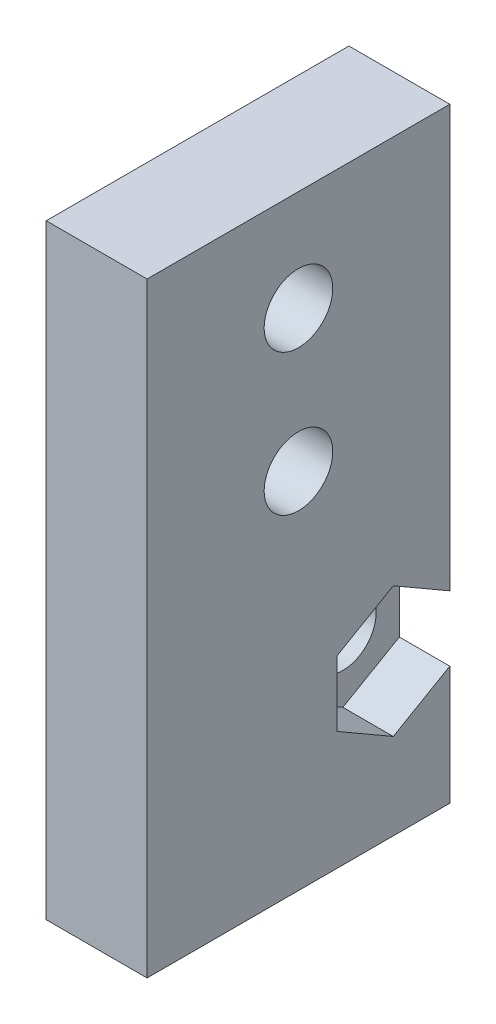
ISO-10303-21;
HEADER;
FILE_DESCRIPTION(('STEP AP214'),'2;1');
FILE_NAME('part.step','',(''),(''),'','','');
FILE_SCHEMA(('AUTOMOTIVE_DESIGN { 1 0 10303 214 1 1 1 1 }'));
ENDSEC;
DATA;
#1=APPLICATION_CONTEXT('core data for automotive mechanical design processes');
#2=APPLICATION_PROTOCOL_DEFINITION('international standard','automotive_design',2000,#1);
#3=PRODUCT_CONTEXT('',#1,'mechanical');
#4=PRODUCT('Part','Part','',(#3));
#5=PRODUCT_RELATED_PRODUCT_CATEGORY('part','',(#4));
#6=PRODUCT_DEFINITION_FORMATION('','',#4);
#7=PRODUCT_DEFINITION_CONTEXT('part definition',#1,'design');
#8=PRODUCT_DEFINITION('design','',#6,#7);
#9=PRODUCT_DEFINITION_SHAPE('','',#8);
#10=(LENGTH_UNIT() NAMED_UNIT(*) SI_UNIT(.MILLI.,.METRE.));
#11=(NAMED_UNIT(*) PLANE_ANGLE_UNIT() SI_UNIT($,.RADIAN.));
#12=(NAMED_UNIT(*) SI_UNIT($,.STERADIAN.) SOLID_ANGLE_UNIT());
#13=UNCERTAINTY_MEASURE_WITH_UNIT(LENGTH_MEASURE(1.E-05),#10,'distance_accuracy_value','');
#14=(GEOMETRIC_REPRESENTATION_CONTEXT(3) GLOBAL_UNCERTAINTY_ASSIGNED_CONTEXT((#13)) GLOBAL_UNIT_ASSIGNED_CONTEXT((#10,
#11,#12)) REPRESENTATION_CONTEXT('',''));
#15=CARTESIAN_POINT('',(0.,0.,0.));
#16=DIRECTION('',(0.,0.,1.));
#17=DIRECTION('',(1.,0.,0.));
#18=AXIS2_PLACEMENT_3D('',#15,#16,#17);
#19=CARTESIAN_POINT('',(2.5,0.,0.));
#20=DIRECTION('',(1.,0.,0.));
#21=DIRECTION('',(0.,0.,1.));
#22=AXIS2_PLACEMENT_3D('',#19,#20,#21);
#23=PLANE('',#22);
#24=CARTESIAN_POINT('',(2.5,18.,7.5));
#25=DIRECTION('',(-1.,0.,0.));
#26=DIRECTION('',(0.,0.,1.));
#27=AXIS2_PLACEMENT_3D('',#24,#25,#26);
#28=CIRCLE('',#27,1.7);
#29=CARTESIAN_POINT('',(2.5,18.,9.2));
#30=VERTEX_POINT('',#29);
#31=EDGE_CURVE('E217',#30,#30,#28,.T.);
#32=ORIENTED_EDGE('',*,*,#31,.T.);
#33=EDGE_LOOP('',(#32));
#34=FACE_BOUND('',#33,.T.);
#35=CARTESIAN_POINT('',(2.5,25.,7.5));
#36=DIRECTION('',(-1.,0.,0.));
#37=DIRECTION('',(0.,0.,1.));
#38=AXIS2_PLACEMENT_3D('',#35,#36,#37);
#39=CIRCLE('',#38,1.7);
#40=CARTESIAN_POINT('',(2.5,25.,9.2));
#41=VERTEX_POINT('',#40);
#42=EDGE_CURVE('E233',#41,#41,#39,.T.);
#43=ORIENTED_EDGE('',*,*,#42,.T.);
#44=EDGE_LOOP('',(#43));
#45=FACE_BOUND('',#44,.T.);
#46=DIRECTION('',(0.,0.5,0.866025403784438));
#47=VECTOR('',#46,1.);
#48=CARTESIAN_POINT('',(2.5,4.26683849253807,2.8));
#49=LINE('',#48,#47);
#50=CARTESIAN_POINT('',(2.5,4.26683849253807,2.8));
#51=VERTEX_POINT('',#50);
#52=CARTESIAN_POINT('',(2.5,5.88341924626903,5.60000000000002));
#53=VERTEX_POINT('',#52);
#54=EDGE_CURVE('E176',#51,#53,#49,.T.);
#55=ORIENTED_EDGE('',*,*,#54,.T.);
#56=DIRECTION('',(0.,1.,0.));
#57=VECTOR('',#56,1.);
#58=CARTESIAN_POINT('',(2.5,5.88341924626903,5.60000000000002));
#59=LINE('',#58,#57);
#60=CARTESIAN_POINT('',(2.5,9.11658075373097,5.60000000000002));
#61=VERTEX_POINT('',#60);
#62=EDGE_CURVE('E180',#53,#61,#59,.T.);
#63=ORIENTED_EDGE('',*,*,#62,.T.);
#64=DIRECTION('',(0.,0.5,-0.866025403784439));
#65=VECTOR('',#64,1.);
#66=CARTESIAN_POINT('',(2.5,9.11658075373097,5.60000000000002));
#67=LINE('',#66,#65);
#68=CARTESIAN_POINT('',(2.5,10.7331615074619,2.8));
#69=VERTEX_POINT('',#68);
#70=EDGE_CURVE('E183',#61,#69,#67,.T.);
#71=ORIENTED_EDGE('',*,*,#70,.T.);
#72=DIRECTION('',(0.,-0.5,-0.866025403784439));
#73=VECTOR('',#72,1.);
#74=CARTESIAN_POINT('',(2.5,10.7331615074619,2.8));
#75=LINE('',#74,#73);
#76=CARTESIAN_POINT('',(2.5,9.11658075373096,0.));
#77=VERTEX_POINT('',#76);
#78=EDGE_CURVE('E186',#69,#77,#75,.T.);
#79=ORIENTED_EDGE('',*,*,#78,.T.);
#80=DIRECTION('',(0.,1.,0.));
#81=VECTOR('',#80,1.);
#82=CARTESIAN_POINT('',(2.5,0.,0.));
#83=LINE('',#82,#81);
#84=CARTESIAN_POINT('',(2.5,30.,0.));
#85=VERTEX_POINT('',#84);
#86=EDGE_CURVE('E223',#77,#85,#83,.T.);
#87=ORIENTED_EDGE('',*,*,#86,.T.);
#88=DIRECTION('',(0.,0.,1.));
#89=VECTOR('',#88,1.);
#90=CARTESIAN_POINT('',(2.5,30.,0.));
#91=LINE('',#90,#89);
#92=CARTESIAN_POINT('',(2.5,30.,15.));
#93=VERTEX_POINT('',#92);
#94=EDGE_CURVE('E220',#85,#93,#91,.T.);
#95=ORIENTED_EDGE('',*,*,#94,.T.);
#96=DIRECTION('',(0.,1.,0.));
#97=VECTOR('',#96,1.);
#98=CARTESIAN_POINT('',(2.5,0.,15.));
#99=LINE('',#98,#97);
#100=CARTESIAN_POINT('',(2.5,0.,15.));
#101=VERTEX_POINT('',#100);
#102=EDGE_CURVE('E230',#101,#93,#99,.T.);
#103=ORIENTED_EDGE('',*,*,#102,.F.);
#104=DIRECTION('',(0.,0.,1.));
#105=VECTOR('',#104,1.);
#106=CARTESIAN_POINT('',(2.5,0.,0.));
#107=LINE('',#106,#105);
#108=CARTESIAN_POINT('',(2.5,0.,0.));
#109=VERTEX_POINT('',#108);
#110=EDGE_CURVE('E227',#109,#101,#107,.T.);
#111=ORIENTED_EDGE('',*,*,#110,.F.);
#112=CARTESIAN_POINT('',(2.5,5.88341924626903,0.));
#113=VERTEX_POINT('',#112);
#114=EDGE_CURVE('E224',#109,#113,#83,.T.);
#115=ORIENTED_EDGE('',*,*,#114,.T.);
#116=DIRECTION('',(0.,-0.5,0.866025403784438));
#117=VECTOR('',#116,1.);
#118=CARTESIAN_POINT('',(2.5,5.88341924626903,0.));
#119=LINE('',#118,#117);
#120=EDGE_CURVE('E173',#113,#51,#119,.T.);
#121=ORIENTED_EDGE('',*,*,#120,.T.);
#122=EDGE_LOOP('',(#55,#63,#71,#79,#87,#95,#103,#111,#115,#121));
#123=FACE_BOUND('',#122,.T.);
#124=ADVANCED_FACE('F37',(#34,#45,#123),#23,.T.);
#125=CARTESIAN_POINT('',(2.5,0.,0.));
#126=DIRECTION('',(0.,0.,-1.));
#127=DIRECTION('',(1.,0.,0.));
#128=AXIS2_PLACEMENT_3D('',#125,#126,#127);
#129=PLANE('',#128);
#130=DIRECTION('',(-1.,0.,0.));
#131=VECTOR('',#130,1.);
#132=CARTESIAN_POINT('',(2.5,30.,0.));
#133=LINE('',#132,#131);
#134=CARTESIAN_POINT('',(-2.5,30.,0.));
#135=VERTEX_POINT('',#134);
#136=EDGE_CURVE('E11',#85,#135,#133,.T.);
#137=ORIENTED_EDGE('',*,*,#136,.F.);
#138=ORIENTED_EDGE('',*,*,#86,.F.);
#139=DIRECTION('',(-1.,0.,0.));
#140=VECTOR('',#139,1.);
#141=CARTESIAN_POINT('',(2.5,9.11658075373096,0.));
#142=LINE('',#141,#140);
#143=CARTESIAN_POINT('',(0.,9.11658075373098,0.));
#144=VERTEX_POINT('',#143);
#145=EDGE_CURVE('E60',#77,#144,#142,.T.);
#146=ORIENTED_EDGE('',*,*,#145,.T.);
#147=DIRECTION('',(0.,1.,0.));
#148=VECTOR('',#147,1.);
#149=CARTESIAN_POINT('',(0.,0.,0.));
#150=LINE('',#149,#148);
#151=CARTESIAN_POINT('',(0.,5.88341924626903,0.));
#152=VERTEX_POINT('',#151);
#153=EDGE_CURVE('E152',#152,#144,#150,.T.);
#154=ORIENTED_EDGE('',*,*,#153,.F.);
#155=DIRECTION('',(-1.,0.,0.));
#156=VECTOR('',#155,1.);
#157=CARTESIAN_POINT('',(2.5,5.88341924626903,0.));
#158=LINE('',#157,#156);
#159=EDGE_CURVE('E214',#113,#152,#158,.T.);
#160=ORIENTED_EDGE('',*,*,#159,.F.);
#161=ORIENTED_EDGE('',*,*,#114,.F.);
#162=DIRECTION('',(-1.,0.,0.));
#163=VECTOR('',#162,1.);
#164=CARTESIAN_POINT('',(2.5,0.,0.));
#165=LINE('',#164,#163);
#166=CARTESIAN_POINT('',(-2.5,0.,0.));
#167=VERTEX_POINT('',#166);
#168=EDGE_CURVE('E45',#109,#167,#165,.T.);
#169=ORIENTED_EDGE('',*,*,#168,.T.);
#170=DIRECTION('',(0.,1.,0.));
#171=VECTOR('',#170,1.);
#172=CARTESIAN_POINT('',(-2.5,0.,0.));
#173=LINE('',#172,#171);
#174=CARTESIAN_POINT('',(-2.5,5.15852610520638,0.));
#175=VERTEX_POINT('',#174);
#176=EDGE_CURVE('E158',#167,#175,#173,.T.);
#177=ORIENTED_EDGE('',*,*,#176,.T.);
#178=DIRECTION('',(1.,0.,0.));
#179=VECTOR('',#178,1.);
#180=CARTESIAN_POINT('',(-3.5,5.15852610520638,0.));
#181=LINE('',#180,#179);
#182=CARTESIAN_POINT('',(-3.5,5.15852610520638,0.));
#183=VERTEX_POINT('',#182);
#184=EDGE_CURVE('E132',#183,#175,#181,.T.);
#185=ORIENTED_EDGE('',*,*,#184,.F.);
#186=DIRECTION('',(0.,1.,0.));
#187=VECTOR('',#186,1.);
#188=CARTESIAN_POINT('',(-3.5,0.,0.));
#189=LINE('',#188,#187);
#190=CARTESIAN_POINT('',(-3.5,9.84147389479362,0.));
#191=VERTEX_POINT('',#190);
#192=EDGE_CURVE('E130',#183,#191,#189,.T.);
#193=ORIENTED_EDGE('',*,*,#192,.T.);
#194=DIRECTION('',(1.,0.,0.));
#195=VECTOR('',#194,1.);
#196=CARTESIAN_POINT('',(-3.5,9.84147389479362,0.));
#197=LINE('',#196,#195);
#198=CARTESIAN_POINT('',(-2.5,9.84147389479362,0.));
#199=VERTEX_POINT('',#198);
#200=EDGE_CURVE('E135',#191,#199,#197,.T.);
#201=ORIENTED_EDGE('',*,*,#200,.T.);
#202=EDGE_CURVE('E156',#199,#135,#173,.T.);
#203=ORIENTED_EDGE('',*,*,#202,.T.);
#204=EDGE_LOOP('',(#137,#138,#146,#154,#160,#161,#169,#177,#185,#193,#201,#203));
#205=FACE_BOUND('',#204,.T.);
#206=ADVANCED_FACE('F141',(#205),#129,.T.);
#207=CARTESIAN_POINT('',(2.5,30.,0.));
#208=DIRECTION('',(0.,1.,0.));
#209=DIRECTION('',(0.,0.,-1.));
#210=AXIS2_PLACEMENT_3D('',#207,#208,#209);
#211=PLANE('',#210);
#212=DIRECTION('',(-1.,0.,0.));
#213=VECTOR('',#212,1.);
#214=CARTESIAN_POINT('',(2.5,30.,15.));
#215=LINE('',#214,#213);
#216=CARTESIAN_POINT('',(-2.5,30.,15.));
#217=VERTEX_POINT('',#216);
#218=EDGE_CURVE('E236',#93,#217,#215,.T.);
#219=ORIENTED_EDGE('',*,*,#218,.F.);
#220=ORIENTED_EDGE('',*,*,#94,.F.);
#221=ORIENTED_EDGE('',*,*,#136,.T.);
#222=DIRECTION('',(0.,0.,1.));
#223=VECTOR('',#222,1.);
#224=CARTESIAN_POINT('',(-2.5,30.,0.));
#225=LINE('',#224,#223);
#226=EDGE_CURVE('E153',#135,#217,#225,.T.);
#227=ORIENTED_EDGE('',*,*,#226,.T.);
#228=EDGE_LOOP('',(#219,#220,#221,#227));
#229=FACE_BOUND('',#228,.T.);
#230=ADVANCED_FACE('F39',(#229),#211,.T.);
#231=CARTESIAN_POINT('',(2.5,0.,0.));
#232=DIRECTION('',(0.,1.,0.));
#233=DIRECTION('',(0.,0.,-1.));
#234=AXIS2_PLACEMENT_3D('',#231,#232,#233);
#235=PLANE('',#234);
#236=ORIENTED_EDGE('',*,*,#168,.F.);
#237=ORIENTED_EDGE('',*,*,#110,.T.);
#238=DIRECTION('',(-1.,0.,0.));
#239=VECTOR('',#238,1.);
#240=CARTESIAN_POINT('',(2.5,0.,15.));
#241=LINE('',#240,#239);
#242=CARTESIAN_POINT('',(-2.5,0.,15.));
#243=VERTEX_POINT('',#242);
#244=EDGE_CURVE('E239',#101,#243,#241,.T.);
#245=ORIENTED_EDGE('',*,*,#244,.T.);
#246=DIRECTION('',(0.,0.,1.));
#247=VECTOR('',#246,1.);
#248=CARTESIAN_POINT('',(-2.5,0.,0.));
#249=LINE('',#248,#247);
#250=EDGE_CURVE('E160',#167,#243,#249,.T.);
#251=ORIENTED_EDGE('',*,*,#250,.F.);
#252=EDGE_LOOP('',(#236,#237,#245,#251));
#253=FACE_BOUND('',#252,.T.);
#254=ADVANCED_FACE('F246',(#253),#235,.F.);
#255=CARTESIAN_POINT('',(2.5,25.,7.5));
#256=DIRECTION('',(-1.,0.,0.));
#257=DIRECTION('',(0.,0.,-1.));
#258=AXIS2_PLACEMENT_3D('',#255,#256,#257);
#259=CYLINDRICAL_SURFACE('',#258,1.7);
#260=ORIENTED_EDGE('',*,*,#42,.F.);
#261=EDGE_LOOP('',(#260));
#262=FACE_BOUND('',#261,.T.);
#263=CARTESIAN_POINT('',(-2.5,25.,7.5));
#264=DIRECTION('',(-1.,0.,0.));
#265=DIRECTION('',(0.,0.,1.));
#266=AXIS2_PLACEMENT_3D('',#263,#264,#265);
#267=CIRCLE('',#266,1.7);
#268=CARTESIAN_POINT('',(-2.5,25.,9.2));
#269=VERTEX_POINT('',#268);
#270=EDGE_CURVE('E165',#269,#269,#267,.T.);
#271=ORIENTED_EDGE('',*,*,#270,.T.);
#272=EDGE_LOOP('',(#271));
#273=FACE_BOUND('',#272,.T.);
#274=ADVANCED_FACE('F267',(#262,#273),#259,.F.);
#275=CARTESIAN_POINT('',(2.5,0.,15.));
#276=DIRECTION('',(0.,0.,-1.));
#277=DIRECTION('',(1.,0.,0.));
#278=AXIS2_PLACEMENT_3D('',#275,#276,#277);
#279=PLANE('',#278);
#280=ORIENTED_EDGE('',*,*,#244,.F.);
#281=ORIENTED_EDGE('',*,*,#102,.T.);
#282=ORIENTED_EDGE('',*,*,#218,.T.);
#283=DIRECTION('',(0.,1.,0.));
#284=VECTOR('',#283,1.);
#285=CARTESIAN_POINT('',(-2.5,0.,15.));
#286=LINE('',#285,#284);
#287=EDGE_CURVE('E163',#243,#217,#286,.T.);
#288=ORIENTED_EDGE('',*,*,#287,.F.);
#289=EDGE_LOOP('',(#280,#281,#282,#288));
#290=FACE_BOUND('',#289,.T.);
#291=ADVANCED_FACE('F264',(#290),#279,.F.);
#292=CARTESIAN_POINT('',(2.5,18.,7.5));
#293=DIRECTION('',(-1.,0.,0.));
#294=DIRECTION('',(0.,0.,-1.));
#295=AXIS2_PLACEMENT_3D('',#292,#293,#294);
#296=CYLINDRICAL_SURFACE('',#295,1.7);
#297=ORIENTED_EDGE('',*,*,#31,.F.);
#298=EDGE_LOOP('',(#297));
#299=FACE_BOUND('',#298,.T.);
#300=CARTESIAN_POINT('',(-2.5,18.,7.5));
#301=DIRECTION('',(-1.,0.,0.));
#302=DIRECTION('',(0.,0.,1.));
#303=AXIS2_PLACEMENT_3D('',#300,#301,#302);
#304=CIRCLE('',#303,1.7);
#305=CARTESIAN_POINT('',(-2.5,18.,9.2));
#306=VERTEX_POINT('',#305);
#307=EDGE_CURVE('E139',#306,#306,#304,.T.);
#308=ORIENTED_EDGE('',*,*,#307,.T.);
#309=EDGE_LOOP('',(#308));
#310=FACE_BOUND('',#309,.T.);
#311=ADVANCED_FACE('F266',(#299,#310),#296,.F.);
#312=CARTESIAN_POINT('',(2.5,5.88341924626903,0.));
#313=DIRECTION('',(0.,0.866025403784438,0.5));
#314=DIRECTION('',(0.,0.5,-0.866025403784439));
#315=AXIS2_PLACEMENT_3D('',#312,#313,#314);
#316=PLANE('',#315);
#317=DIRECTION('',(0.,-0.5,0.866025403784438));
#318=VECTOR('',#317,1.);
#319=CARTESIAN_POINT('',(0.,5.88341924626903,0.));
#320=LINE('',#319,#318);
#321=CARTESIAN_POINT('',(0.,4.26683849253807,2.8));
#322=VERTEX_POINT('',#321);
#323=EDGE_CURVE('E168',#152,#322,#320,.T.);
#324=ORIENTED_EDGE('',*,*,#323,.T.);
#325=DIRECTION('',(-1.,0.,0.));
#326=VECTOR('',#325,1.);
#327=CARTESIAN_POINT('',(2.5,4.26683849253807,2.8));
#328=LINE('',#327,#326);
#329=EDGE_CURVE('E211',#51,#322,#328,.T.);
#330=ORIENTED_EDGE('',*,*,#329,.F.);
#331=ORIENTED_EDGE('',*,*,#120,.F.);
#332=ORIENTED_EDGE('',*,*,#159,.T.);
#333=EDGE_LOOP('',(#324,#330,#331,#332));
#334=FACE_BOUND('',#333,.T.);
#335=ADVANCED_FACE('F261',(#334),#316,.T.);
#336=CARTESIAN_POINT('',(2.5,4.26683849253807,2.8));
#337=DIRECTION('',(0.,0.866025403784438,-0.5));
#338=DIRECTION('',(0.,-0.5,-0.866025403784439));
#339=AXIS2_PLACEMENT_3D('',#336,#337,#338);
#340=PLANE('',#339);
#341=DIRECTION('',(0.,0.5,0.866025403784438));
#342=VECTOR('',#341,1.);
#343=CARTESIAN_POINT('',(0.,4.26683849253807,2.8));
#344=LINE('',#343,#342);
#345=CARTESIAN_POINT('',(0.,5.88341924626903,5.60000000000002));
#346=VERTEX_POINT('',#345);
#347=EDGE_CURVE('E191',#322,#346,#344,.T.);
#348=ORIENTED_EDGE('',*,*,#347,.T.);
#349=DIRECTION('',(-1.,0.,0.));
#350=VECTOR('',#349,1.);
#351=CARTESIAN_POINT('',(2.5,5.88341924626903,5.60000000000002));
#352=LINE('',#351,#350);
#353=EDGE_CURVE('E208',#53,#346,#352,.T.);
#354=ORIENTED_EDGE('',*,*,#353,.F.);
#355=ORIENTED_EDGE('',*,*,#54,.F.);
#356=ORIENTED_EDGE('',*,*,#329,.T.);
#357=EDGE_LOOP('',(#348,#354,#355,#356));
#358=FACE_BOUND('',#357,.T.);
#359=ADVANCED_FACE('F288',(#358),#340,.T.);
#360=CARTESIAN_POINT('',(2.5,5.88341924626903,5.60000000000002));
#361=DIRECTION('',(0.,0.,-1.));
#362=DIRECTION('',(1.,0.,0.));
#363=AXIS2_PLACEMENT_3D('',#360,#361,#362);
#364=PLANE('',#363);
#365=DIRECTION('',(0.,1.,0.));
#366=VECTOR('',#365,1.);
#367=CARTESIAN_POINT('',(0.,5.88341924626903,5.60000000000002));
#368=LINE('',#367,#366);
#369=CARTESIAN_POINT('',(0.,9.11658075373097,5.60000000000002));
#370=VERTEX_POINT('',#369);
#371=EDGE_CURVE('E194',#346,#370,#368,.T.);
#372=ORIENTED_EDGE('',*,*,#371,.T.);
#373=DIRECTION('',(-1.,0.,0.));
#374=VECTOR('',#373,1.);
#375=CARTESIAN_POINT('',(2.5,9.11658075373097,5.60000000000002));
#376=LINE('',#375,#374);
#377=EDGE_CURVE('E205',#61,#370,#376,.T.);
#378=ORIENTED_EDGE('',*,*,#377,.F.);
#379=ORIENTED_EDGE('',*,*,#62,.F.);
#380=ORIENTED_EDGE('',*,*,#353,.T.);
#381=EDGE_LOOP('',(#372,#378,#379,#380));
#382=FACE_BOUND('',#381,.T.);
#383=ADVANCED_FACE('F291',(#382),#364,.T.);
#384=CARTESIAN_POINT('',(2.5,9.11658075373097,5.60000000000002));
#385=DIRECTION('',(0.,-0.866025403784439,-0.5));
#386=DIRECTION('',(0.,-0.5,0.866025403784439));
#387=AXIS2_PLACEMENT_3D('',#384,#385,#386);
#388=PLANE('',#387);
#389=DIRECTION('',(0.,0.5,-0.866025403784439));
#390=VECTOR('',#389,1.);
#391=CARTESIAN_POINT('',(0.,9.11658075373097,5.60000000000002));
#392=LINE('',#391,#390);
#393=CARTESIAN_POINT('',(0.,10.7331615074619,2.8));
#394=VERTEX_POINT('',#393);
#395=EDGE_CURVE('E197',#370,#394,#392,.T.);
#396=ORIENTED_EDGE('',*,*,#395,.T.);
#397=DIRECTION('',(-1.,0.,0.));
#398=VECTOR('',#397,1.);
#399=CARTESIAN_POINT('',(2.5,10.7331615074619,2.8));
#400=LINE('',#399,#398);
#401=EDGE_CURVE('E202',#69,#394,#400,.T.);
#402=ORIENTED_EDGE('',*,*,#401,.F.);
#403=ORIENTED_EDGE('',*,*,#70,.F.);
#404=ORIENTED_EDGE('',*,*,#377,.T.);
#405=EDGE_LOOP('',(#396,#402,#403,#404));
#406=FACE_BOUND('',#405,.T.);
#407=ADVANCED_FACE('F295',(#406),#388,.T.);
#408=CARTESIAN_POINT('',(2.5,10.7331615074619,2.8));
#409=DIRECTION('',(0.,-0.866025403784438,0.5));
#410=DIRECTION('',(0.,0.5,0.866025403784438));
#411=AXIS2_PLACEMENT_3D('',#408,#409,#410);
#412=PLANE('',#411);
#413=DIRECTION('',(0.,-0.5,-0.866025403784439));
#414=VECTOR('',#413,1.);
#415=CARTESIAN_POINT('',(0.,10.7331615074619,2.8));
#416=LINE('',#415,#414);
#417=EDGE_CURVE('E177',#394,#144,#416,.T.);
#418=ORIENTED_EDGE('',*,*,#417,.T.);
#419=ORIENTED_EDGE('',*,*,#145,.F.);
#420=ORIENTED_EDGE('',*,*,#78,.F.);
#421=ORIENTED_EDGE('',*,*,#401,.T.);
#422=EDGE_LOOP('',(#418,#419,#420,#421));
#423=FACE_BOUND('',#422,.T.);
#424=ADVANCED_FACE('F299',(#423),#412,.T.);
#425=CARTESIAN_POINT('',(-2.5,7.5,2.8));
#426=DIRECTION('',(1.,0.,0.));
#427=DIRECTION('',(0.,0.,1.));
#428=AXIS2_PLACEMENT_3D('',#425,#426,#427);
#429=CYLINDRICAL_SURFACE('',#428,1.65);
#430=CARTESIAN_POINT('',(0.,7.5,2.8));
#431=DIRECTION('',(-1.,0.,0.));
#432=DIRECTION('',(0.,0.,1.));
#433=AXIS2_PLACEMENT_3D('',#430,#431,#432);
#434=CIRCLE('',#433,1.65);
#435=CARTESIAN_POINT('',(0.,7.5,4.45));
#436=VERTEX_POINT('',#435);
#437=EDGE_CURVE('E157',#436,#436,#434,.T.);
#438=ORIENTED_EDGE('',*,*,#437,.F.);
#439=EDGE_LOOP('',(#438));
#440=FACE_BOUND('',#439,.T.);
#441=CARTESIAN_POINT('',(-3.5,7.5,2.8));
#442=DIRECTION('',(1.,0.,0.));
#443=DIRECTION('',(0.,0.,-1.));
#444=AXIS2_PLACEMENT_3D('',#441,#442,#443);
#445=CIRCLE('',#444,1.65);
#446=CARTESIAN_POINT('',(-3.5,7.5,1.15));
#447=VERTEX_POINT('',#446);
#448=EDGE_CURVE('E143',#447,#447,#445,.F.);
#449=ORIENTED_EDGE('',*,*,#448,.T.);
#450=EDGE_LOOP('',(#449));
#451=FACE_BOUND('',#450,.T.);
#452=ADVANCED_FACE('F303',(#440,#451),#429,.F.);
#453=CARTESIAN_POINT('',(-2.5,0.,0.));
#454=DIRECTION('',(1.,0.,0.));
#455=DIRECTION('',(0.,0.,1.));
#456=AXIS2_PLACEMENT_3D('',#453,#454,#455);
#457=PLANE('',#456);
#458=CARTESIAN_POINT('',(-2.5,7.5,2.8));
#459=DIRECTION('',(1.,0.,0.));
#460=DIRECTION('',(0.,0.,-1.));
#461=AXIS2_PLACEMENT_3D('',#458,#459,#460);
#462=CIRCLE('',#461,3.65);
#463=EDGE_CURVE('E52',#199,#175,#462,.T.);
#464=ORIENTED_EDGE('',*,*,#463,.T.);
#465=ORIENTED_EDGE('',*,*,#176,.F.);
#466=ORIENTED_EDGE('',*,*,#250,.T.);
#467=ORIENTED_EDGE('',*,*,#287,.T.);
#468=ORIENTED_EDGE('',*,*,#226,.F.);
#469=ORIENTED_EDGE('',*,*,#202,.F.);
#470=EDGE_LOOP('',(#464,#465,#466,#467,#468,#469));
#471=FACE_BOUND('',#470,.T.);
#472=ORIENTED_EDGE('',*,*,#307,.F.);
#473=EDGE_LOOP('',(#472));
#474=FACE_BOUND('',#473,.T.);
#475=ORIENTED_EDGE('',*,*,#270,.F.);
#476=EDGE_LOOP('',(#475));
#477=FACE_BOUND('',#476,.T.);
#478=ADVANCED_FACE('F249',(#471,#474,#477),#457,.F.);
#479=CARTESIAN_POINT('',(0.,0.,0.));
#480=DIRECTION('',(1.,0.,0.));
#481=DIRECTION('',(0.,0.,1.));
#482=AXIS2_PLACEMENT_3D('',#479,#480,#481);
#483=PLANE('',#482);
#484=ORIENTED_EDGE('',*,*,#153,.T.);
#485=ORIENTED_EDGE('',*,*,#417,.F.);
#486=ORIENTED_EDGE('',*,*,#395,.F.);
#487=ORIENTED_EDGE('',*,*,#371,.F.);
#488=ORIENTED_EDGE('',*,*,#347,.F.);
#489=ORIENTED_EDGE('',*,*,#323,.F.);
#490=EDGE_LOOP('',(#484,#485,#486,#487,#488,#489));
#491=FACE_BOUND('',#490,.T.);
#492=ORIENTED_EDGE('',*,*,#437,.T.);
#493=EDGE_LOOP('',(#492));
#494=FACE_BOUND('',#493,.T.);
#495=ADVANCED_FACE('F258',(#491,#494),#483,.T.);
#496=CARTESIAN_POINT('',(-3.5,7.5,2.8));
#497=DIRECTION('',(1.,0.,0.));
#498=DIRECTION('',(0.,0.,1.));
#499=AXIS2_PLACEMENT_3D('',#496,#497,#498);
#500=CYLINDRICAL_SURFACE('',#499,3.65);
#501=ORIENTED_EDGE('',*,*,#463,.F.);
#502=ORIENTED_EDGE('',*,*,#200,.F.);
#503=CARTESIAN_POINT('',(-3.5,7.5,2.8));
#504=DIRECTION('',(1.,0.,0.));
#505=DIRECTION('',(0.,0.,-1.));
#506=AXIS2_PLACEMENT_3D('',#503,#504,#505);
#507=CIRCLE('',#506,3.65);
#508=EDGE_CURVE('E127',#191,#183,#507,.T.);
#509=ORIENTED_EDGE('',*,*,#508,.T.);
#510=ORIENTED_EDGE('',*,*,#184,.T.);
#511=EDGE_LOOP('',(#501,#502,#509,#510));
#512=FACE_BOUND('',#511,.T.);
#513=ADVANCED_FACE('F136',(#512),#500,.T.);
#514=CARTESIAN_POINT('',(-3.5,0.,0.));
#515=DIRECTION('',(-1.,0.,0.));
#516=DIRECTION('',(0.,0.,-1.));
#517=AXIS2_PLACEMENT_3D('',#514,#515,#516);
#518=PLANE('',#517);
#519=ORIENTED_EDGE('',*,*,#448,.F.);
#520=EDGE_LOOP('',(#519));
#521=FACE_BOUND('',#520,.T.);
#522=ORIENTED_EDGE('',*,*,#192,.F.);
#523=ORIENTED_EDGE('',*,*,#508,.F.);
#524=EDGE_LOOP('',(#522,#523));
#525=FACE_BOUND('',#524,.T.);
#526=ADVANCED_FACE('F128',(#521,#525),#518,.T.);
#527=CLOSED_SHELL('',(#124,#206,#230,#254,#274,#291,#311,#335,#359,#383,#407,#424,#452,#478,
#495,#513,#526));
#528=MANIFOLD_SOLID_BREP('B2',#527);
#529=ADVANCED_BREP_SHAPE_REPRESENTATION('',(#18,#528),#14);
#530=SHAPE_DEFINITION_REPRESENTATION(#9,#529);
ENDSEC;
END-ISO-10303-21;
